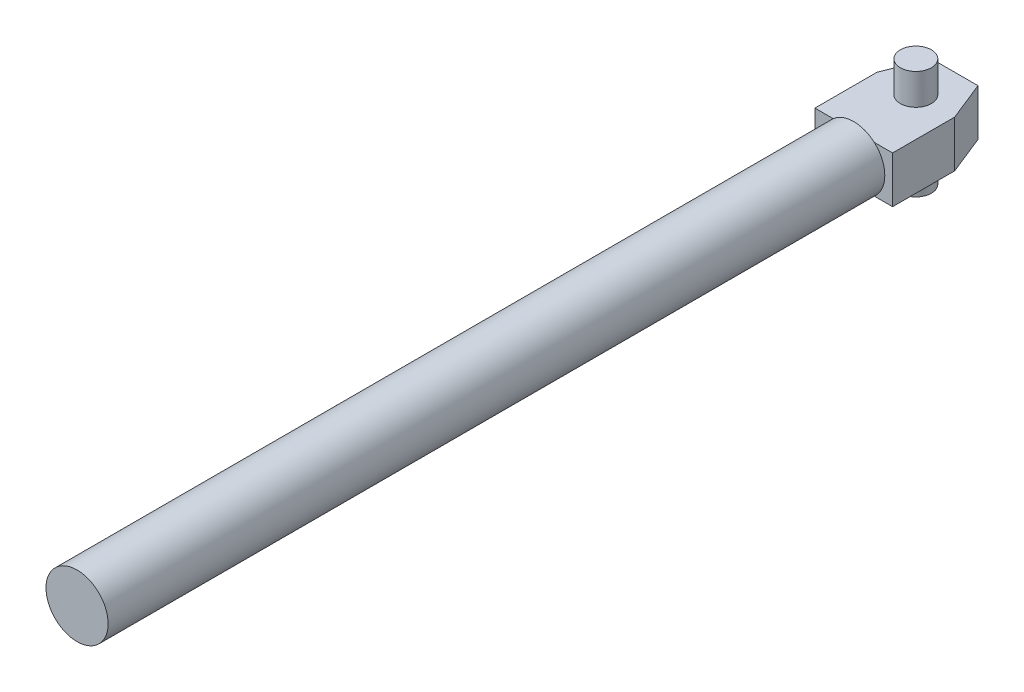
ISO-10303-21;
HEADER;
FILE_DESCRIPTION(('STEP AP214'),'2;1');
FILE_NAME('part.step','',(''),(''),'','','');
FILE_SCHEMA(('AUTOMOTIVE_DESIGN { 1 0 10303 214 1 1 1 1 }'));
ENDSEC;
DATA;
#1=APPLICATION_CONTEXT('core data for automotive mechanical design processes');
#2=APPLICATION_PROTOCOL_DEFINITION('international standard','automotive_design',2000,#1);
#3=PRODUCT_CONTEXT('',#1,'mechanical');
#4=PRODUCT('Part','Part','',(#3));
#5=PRODUCT_RELATED_PRODUCT_CATEGORY('part','',(#4));
#6=PRODUCT_DEFINITION_FORMATION('','',#4);
#7=PRODUCT_DEFINITION_CONTEXT('part definition',#1,'design');
#8=PRODUCT_DEFINITION('design','',#6,#7);
#9=PRODUCT_DEFINITION_SHAPE('','',#8);
#10=(LENGTH_UNIT() NAMED_UNIT(*) SI_UNIT(.MILLI.,.METRE.));
#11=(NAMED_UNIT(*) PLANE_ANGLE_UNIT() SI_UNIT($,.RADIAN.));
#12=(NAMED_UNIT(*) SI_UNIT($,.STERADIAN.) SOLID_ANGLE_UNIT());
#13=UNCERTAINTY_MEASURE_WITH_UNIT(LENGTH_MEASURE(1.E-05),#10,'distance_accuracy_value','');
#14=(GEOMETRIC_REPRESENTATION_CONTEXT(3) GLOBAL_UNCERTAINTY_ASSIGNED_CONTEXT((#13)) GLOBAL_UNIT_ASSIGNED_CONTEXT((#10,
#11,#12)) REPRESENTATION_CONTEXT('',''));
#15=CARTESIAN_POINT('',(0.,0.,0.));
#16=DIRECTION('',(0.,0.,1.));
#17=DIRECTION('',(1.,0.,0.));
#18=AXIS2_PLACEMENT_3D('',#15,#16,#17);
#19=CARTESIAN_POINT('',(0.,0.,0.));
#20=DIRECTION('',(0.,0.,1.));
#21=DIRECTION('',(1.,0.,0.));
#22=AXIS2_PLACEMENT_3D('',#19,#20,#21);
#23=PLANE('',#22);
#24=DIRECTION('',(1.,0.,0.));
#25=VECTOR('',#24,1.);
#26=CARTESIAN_POINT('',(-25.,15.,0.));
#27=LINE('',#26,#25);
#28=CARTESIAN_POINT('',(-13.2287565553229,15.,0.));
#29=VERTEX_POINT('',#28);
#30=CARTESIAN_POINT('',(13.2287565553229,15.,0.));
#31=VERTEX_POINT('',#30);
#32=EDGE_CURVE('E112',#29,#31,#27,.T.);
#33=ORIENTED_EDGE('',*,*,#32,.F.);
#34=CARTESIAN_POINT('',(0.,0.,0.));
#35=DIRECTION('',(0.,0.,1.));
#36=DIRECTION('',(1.,0.,0.));
#37=AXIS2_PLACEMENT_3D('',#34,#35,#36);
#38=CIRCLE('',#37,20.);
#39=EDGE_CURVE('E130',#31,#29,#38,.T.);
#40=ORIENTED_EDGE('',*,*,#39,.F.);
#41=EDGE_LOOP('',(#33,#40));
#42=FACE_BOUND('',#41,.T.);
#43=ADVANCED_FACE('F36',(#42),#23,.F.);
#44=CARTESIAN_POINT('',(0.,0.,500.));
#45=DIRECTION('',(0.,0.,-1.));
#46=DIRECTION('',(-1.,0.,0.));
#47=AXIS2_PLACEMENT_3D('',#44,#45,#46);
#48=CYLINDRICAL_SURFACE('',#47,20.);
#49=CARTESIAN_POINT('',(0.,0.,500.));
#50=DIRECTION('',(0.,0.,1.));
#51=DIRECTION('',(1.,0.,0.));
#52=AXIS2_PLACEMENT_3D('',#49,#50,#51);
#53=CIRCLE('',#52,20.);
#54=CARTESIAN_POINT('',(20.,0.,500.));
#55=VERTEX_POINT('',#54);
#56=EDGE_CURVE('E136',#55,#55,#53,.T.);
#57=ORIENTED_EDGE('',*,*,#56,.F.);
#58=EDGE_LOOP('',(#57));
#59=FACE_BOUND('',#58,.T.);
#60=ORIENTED_EDGE('',*,*,#39,.T.);
#61=CARTESIAN_POINT('',(-13.2287565553229,-15.,0.));
#62=VERTEX_POINT('',#61);
#63=EDGE_CURVE('E106',#29,#62,#38,.T.);
#64=ORIENTED_EDGE('',*,*,#63,.T.);
#65=CARTESIAN_POINT('',(13.2287565553229,-15.,0.));
#66=VERTEX_POINT('',#65);
#67=EDGE_CURVE('E52',#62,#66,#38,.T.);
#68=ORIENTED_EDGE('',*,*,#67,.T.);
#69=EDGE_CURVE('E126',#66,#31,#38,.T.);
#70=ORIENTED_EDGE('',*,*,#69,.T.);
#71=EDGE_LOOP('',(#60,#64,#68,#70));
#72=FACE_BOUND('',#71,.T.);
#73=ADVANCED_FACE('F38',(#59,#72),#48,.T.);
#74=CARTESIAN_POINT('',(0.,0.,500.));
#75=DIRECTION('',(0.,0.,1.));
#76=DIRECTION('',(1.,0.,0.));
#77=AXIS2_PLACEMENT_3D('',#74,#75,#76);
#78=PLANE('',#77);
#79=ORIENTED_EDGE('',*,*,#56,.T.);
#80=EDGE_LOOP('',(#79));
#81=FACE_BOUND('',#80,.T.);
#82=ADVANCED_FACE('F207',(#81),#78,.T.);
#83=ORIENTED_EDGE('',*,*,#67,.F.);
#84=DIRECTION('',(1.,0.,0.));
#85=VECTOR('',#84,1.);
#86=CARTESIAN_POINT('',(-25.,-15.,0.));
#87=LINE('',#86,#85);
#88=EDGE_CURVE('E44',#62,#66,#87,.T.);
#89=ORIENTED_EDGE('',*,*,#88,.T.);
#90=EDGE_LOOP('',(#83,#89));
#91=FACE_BOUND('',#90,.T.);
#92=ADVANCED_FACE('F203',(#91),#23,.F.);
#93=CARTESIAN_POINT('',(-25.,15.,0.));
#94=DIRECTION('',(0.,0.,-1.));
#95=DIRECTION('',(-1.,0.,0.));
#96=AXIS2_PLACEMENT_3D('',#93,#94,#95);
#97=PLANE('',#96);
#98=ORIENTED_EDGE('',*,*,#63,.F.);
#99=CARTESIAN_POINT('',(-25.,15.,0.));
#100=VERTEX_POINT('',#99);
#101=EDGE_CURVE('E99',#100,#29,#27,.T.);
#102=ORIENTED_EDGE('',*,*,#101,.F.);
#103=DIRECTION('',(0.,-1.,0.));
#104=VECTOR('',#103,1.);
#105=CARTESIAN_POINT('',(-25.,15.,0.));
#106=LINE('',#105,#104);
#107=CARTESIAN_POINT('',(-25.,-15.,0.));
#108=VERTEX_POINT('',#107);
#109=EDGE_CURVE('E104',#100,#108,#106,.T.);
#110=ORIENTED_EDGE('',*,*,#109,.T.);
#111=EDGE_CURVE('E152',#108,#62,#87,.T.);
#112=ORIENTED_EDGE('',*,*,#111,.T.);
#113=EDGE_LOOP('',(#98,#102,#110,#112));
#114=FACE_BOUND('',#113,.T.);
#115=ADVANCED_FACE('F101',(#114),#97,.F.);
#116=CARTESIAN_POINT('',(-25.,15.,0.));
#117=DIRECTION('',(1.,0.,0.));
#118=DIRECTION('',(0.,0.,-1.));
#119=AXIS2_PLACEMENT_3D('',#116,#117,#118);
#120=PLANE('',#119);
#121=DIRECTION('',(0.,0.,1.));
#122=VECTOR('',#121,1.);
#123=CARTESIAN_POINT('',(-25.,-15.,0.));
#124=LINE('',#123,#122);
#125=CARTESIAN_POINT('',(-25.,-15.,-40.));
#126=VERTEX_POINT('',#125);
#127=EDGE_CURVE('E125',#126,#108,#124,.T.);
#128=ORIENTED_EDGE('',*,*,#127,.T.);
#129=ORIENTED_EDGE('',*,*,#109,.F.);
#130=DIRECTION('',(0.,0.,1.));
#131=VECTOR('',#130,1.);
#132=CARTESIAN_POINT('',(-25.,15.,0.));
#133=LINE('',#132,#131);
#134=CARTESIAN_POINT('',(-25.,15.,-40.));
#135=VERTEX_POINT('',#134);
#136=EDGE_CURVE('E114',#135,#100,#133,.T.);
#137=ORIENTED_EDGE('',*,*,#136,.F.);
#138=DIRECTION('',(0.,-1.,0.));
#139=VECTOR('',#138,1.);
#140=CARTESIAN_POINT('',(-25.,15.,-40.));
#141=LINE('',#140,#139);
#142=EDGE_CURVE('E169',#135,#126,#141,.T.);
#143=ORIENTED_EDGE('',*,*,#142,.T.);
#144=EDGE_LOOP('',(#128,#129,#137,#143));
#145=FACE_BOUND('',#144,.T.);
#146=ADVANCED_FACE('F123',(#145),#120,.F.);
#147=ORIENTED_EDGE('',*,*,#69,.F.);
#148=CARTESIAN_POINT('',(25.,-15.,0.));
#149=VERTEX_POINT('',#148);
#150=EDGE_CURVE('E146',#66,#149,#87,.T.);
#151=ORIENTED_EDGE('',*,*,#150,.T.);
#152=DIRECTION('',(0.,-1.,0.));
#153=VECTOR('',#152,1.);
#154=CARTESIAN_POINT('',(25.,15.,0.));
#155=LINE('',#154,#153);
#156=CARTESIAN_POINT('',(25.,15.,0.));
#157=VERTEX_POINT('',#156);
#158=EDGE_CURVE('E127',#157,#149,#155,.T.);
#159=ORIENTED_EDGE('',*,*,#158,.F.);
#160=EDGE_CURVE('E110',#31,#157,#27,.T.);
#161=ORIENTED_EDGE('',*,*,#160,.F.);
#162=EDGE_LOOP('',(#147,#151,#159,#161));
#163=FACE_BOUND('',#162,.T.);
#164=ADVANCED_FACE('F144',(#163),#97,.F.);
#165=CARTESIAN_POINT('',(25.,15.,0.));
#166=DIRECTION('',(-1.,0.,0.));
#167=DIRECTION('',(0.,0.,1.));
#168=AXIS2_PLACEMENT_3D('',#165,#166,#167);
#169=PLANE('',#168);
#170=DIRECTION('',(0.,0.,-1.));
#171=VECTOR('',#170,1.);
#172=CARTESIAN_POINT('',(25.,-15.,0.));
#173=LINE('',#172,#171);
#174=CARTESIAN_POINT('',(25.,-15.,-40.));
#175=VERTEX_POINT('',#174);
#176=EDGE_CURVE('E151',#149,#175,#173,.T.);
#177=ORIENTED_EDGE('',*,*,#176,.T.);
#178=DIRECTION('',(0.,-1.,0.));
#179=VECTOR('',#178,1.);
#180=CARTESIAN_POINT('',(25.,15.,-40.));
#181=LINE('',#180,#179);
#182=CARTESIAN_POINT('',(25.,15.,-40.));
#183=VERTEX_POINT('',#182);
#184=EDGE_CURVE('E132',#183,#175,#181,.T.);
#185=ORIENTED_EDGE('',*,*,#184,.F.);
#186=DIRECTION('',(0.,0.,-1.));
#187=VECTOR('',#186,1.);
#188=CARTESIAN_POINT('',(25.,15.,0.));
#189=LINE('',#188,#187);
#190=EDGE_CURVE('E109',#157,#183,#189,.T.);
#191=ORIENTED_EDGE('',*,*,#190,.F.);
#192=ORIENTED_EDGE('',*,*,#158,.T.);
#193=EDGE_LOOP('',(#177,#185,#191,#192));
#194=FACE_BOUND('',#193,.T.);
#195=ADVANCED_FACE('F161',(#194),#169,.F.);
#196=CARTESIAN_POINT('',(15.,15.,-65.));
#197=DIRECTION('',(-0.928476690885259,0.,0.371390676354104));
#198=DIRECTION('',(0.371390676354104,0.,0.928476690885259));
#199=AXIS2_PLACEMENT_3D('',#196,#197,#198);
#200=PLANE('',#199);
#201=DIRECTION('',(-0.371390676354104,0.,-0.928476690885259));
#202=VECTOR('',#201,1.);
#203=CARTESIAN_POINT('',(15.,-15.,-65.));
#204=LINE('',#203,#202);
#205=CARTESIAN_POINT('',(15.,-15.,-65.));
#206=VERTEX_POINT('',#205);
#207=EDGE_CURVE('E182',#175,#206,#204,.T.);
#208=ORIENTED_EDGE('',*,*,#207,.T.);
#209=DIRECTION('',(0.,-1.,0.));
#210=VECTOR('',#209,1.);
#211=CARTESIAN_POINT('',(15.,15.,-65.));
#212=LINE('',#211,#210);
#213=CARTESIAN_POINT('',(15.,15.,-65.));
#214=VERTEX_POINT('',#213);
#215=EDGE_CURVE('E173',#214,#206,#212,.T.);
#216=ORIENTED_EDGE('',*,*,#215,.F.);
#217=DIRECTION('',(-0.371390676354104,0.,-0.928476690885259));
#218=VECTOR('',#217,1.);
#219=CARTESIAN_POINT('',(15.,15.,-65.));
#220=LINE('',#219,#218);
#221=EDGE_CURVE('E164',#183,#214,#220,.T.);
#222=ORIENTED_EDGE('',*,*,#221,.F.);
#223=ORIENTED_EDGE('',*,*,#184,.T.);
#224=EDGE_LOOP('',(#208,#216,#222,#223));
#225=FACE_BOUND('',#224,.T.);
#226=ADVANCED_FACE('F180',(#225),#200,.F.);
#227=CARTESIAN_POINT('',(-15.,15.,-65.));
#228=DIRECTION('',(0.,0.,1.));
#229=DIRECTION('',(1.,0.,0.));
#230=AXIS2_PLACEMENT_3D('',#227,#228,#229);
#231=PLANE('',#230);
#232=DIRECTION('',(-1.,0.,0.));
#233=VECTOR('',#232,1.);
#234=CARTESIAN_POINT('',(-15.,-15.,-65.));
#235=LINE('',#234,#233);
#236=CARTESIAN_POINT('',(-15.,-15.,-65.));
#237=VERTEX_POINT('',#236);
#238=EDGE_CURVE('E185',#206,#237,#235,.T.);
#239=ORIENTED_EDGE('',*,*,#238,.T.);
#240=DIRECTION('',(0.,-1.,0.));
#241=VECTOR('',#240,1.);
#242=CARTESIAN_POINT('',(-15.,15.,-65.));
#243=LINE('',#242,#241);
#244=CARTESIAN_POINT('',(-15.,15.,-65.));
#245=VERTEX_POINT('',#244);
#246=EDGE_CURVE('E170',#245,#237,#243,.T.);
#247=ORIENTED_EDGE('',*,*,#246,.F.);
#248=DIRECTION('',(-1.,0.,0.));
#249=VECTOR('',#248,1.);
#250=CARTESIAN_POINT('',(-15.,15.,-65.));
#251=LINE('',#250,#249);
#252=EDGE_CURVE('E165',#214,#245,#251,.T.);
#253=ORIENTED_EDGE('',*,*,#252,.F.);
#254=ORIENTED_EDGE('',*,*,#215,.T.);
#255=EDGE_LOOP('',(#239,#247,#253,#254));
#256=FACE_BOUND('',#255,.T.);
#257=ADVANCED_FACE('F192',(#256),#231,.F.);
#258=CARTESIAN_POINT('',(-25.,15.,-40.));
#259=DIRECTION('',(0.928476690885259,0.,0.371390676354103));
#260=DIRECTION('',(0.371390676354103,0.,-0.92847669088526));
#261=AXIS2_PLACEMENT_3D('',#258,#259,#260);
#262=PLANE('',#261);
#263=DIRECTION('',(-0.371390676354103,0.,0.928476690885259));
#264=VECTOR('',#263,1.);
#265=CARTESIAN_POINT('',(-25.,-15.,-40.));
#266=LINE('',#265,#264);
#267=EDGE_CURVE('E121',#237,#126,#266,.T.);
#268=ORIENTED_EDGE('',*,*,#267,.T.);
#269=ORIENTED_EDGE('',*,*,#142,.F.);
#270=DIRECTION('',(-0.371390676354103,0.,0.928476690885259));
#271=VECTOR('',#270,1.);
#272=CARTESIAN_POINT('',(-25.,15.,-40.));
#273=LINE('',#272,#271);
#274=EDGE_CURVE('E117',#245,#135,#273,.T.);
#275=ORIENTED_EDGE('',*,*,#274,.F.);
#276=ORIENTED_EDGE('',*,*,#246,.T.);
#277=EDGE_LOOP('',(#268,#269,#275,#276));
#278=FACE_BOUND('',#277,.T.);
#279=ADVANCED_FACE('F190',(#278),#262,.F.);
#280=CARTESIAN_POINT('',(0.,15.,0.));
#281=DIRECTION('',(0.,-1.,0.));
#282=DIRECTION('',(0.,0.,-1.));
#283=AXIS2_PLACEMENT_3D('',#280,#281,#282);
#284=PLANE('',#283);
#285=CARTESIAN_POINT('',(0.,15.,-40.));
#286=DIRECTION('',(0.,-1.,0.));
#287=DIRECTION('',(0.,0.,-1.));
#288=AXIS2_PLACEMENT_3D('',#285,#286,#287);
#289=CIRCLE('',#288,10.);
#290=CARTESIAN_POINT('',(0.,15.,-50.));
#291=VERTEX_POINT('',#290);
#292=EDGE_CURVE('E154',#291,#291,#289,.T.);
#293=ORIENTED_EDGE('',*,*,#292,.T.);
#294=EDGE_LOOP('',(#293));
#295=FACE_BOUND('',#294,.T.);
#296=ORIENTED_EDGE('',*,*,#136,.T.);
#297=ORIENTED_EDGE('',*,*,#101,.T.);
#298=ORIENTED_EDGE('',*,*,#32,.T.);
#299=ORIENTED_EDGE('',*,*,#160,.T.);
#300=ORIENTED_EDGE('',*,*,#190,.T.);
#301=ORIENTED_EDGE('',*,*,#221,.T.);
#302=ORIENTED_EDGE('',*,*,#252,.T.);
#303=ORIENTED_EDGE('',*,*,#274,.T.);
#304=EDGE_LOOP('',(#296,#297,#298,#299,#300,#301,#302,#303));
#305=FACE_BOUND('',#304,.T.);
#306=ADVANCED_FACE('F115',(#295,#305),#284,.F.);
#307=CARTESIAN_POINT('',(0.,-15.,0.));
#308=DIRECTION('',(0.,-1.,0.));
#309=DIRECTION('',(0.,0.,-1.));
#310=AXIS2_PLACEMENT_3D('',#307,#308,#309);
#311=PLANE('',#310);
#312=CARTESIAN_POINT('',(0.,-15.,-40.));
#313=DIRECTION('',(0.,-1.,0.));
#314=DIRECTION('',(0.,0.,-1.));
#315=AXIS2_PLACEMENT_3D('',#312,#313,#314);
#316=CIRCLE('',#315,10.);
#317=CARTESIAN_POINT('',(0.,-15.,-50.));
#318=VERTEX_POINT('',#317);
#319=EDGE_CURVE('E11',#318,#318,#316,.T.);
#320=ORIENTED_EDGE('',*,*,#319,.F.);
#321=EDGE_LOOP('',(#320));
#322=FACE_BOUND('',#321,.T.);
#323=ORIENTED_EDGE('',*,*,#127,.F.);
#324=ORIENTED_EDGE('',*,*,#267,.F.);
#325=ORIENTED_EDGE('',*,*,#238,.F.);
#326=ORIENTED_EDGE('',*,*,#207,.F.);
#327=ORIENTED_EDGE('',*,*,#176,.F.);
#328=ORIENTED_EDGE('',*,*,#150,.F.);
#329=ORIENTED_EDGE('',*,*,#88,.F.);
#330=ORIENTED_EDGE('',*,*,#111,.F.);
#331=EDGE_LOOP('',(#323,#324,#325,#326,#327,#328,#329,#330));
#332=FACE_BOUND('',#331,.T.);
#333=ADVANCED_FACE('F149',(#322,#332),#311,.T.);
#334=CARTESIAN_POINT('',(0.,-35.,-40.));
#335=DIRECTION('',(0.,1.,0.));
#336=DIRECTION('',(0.,0.,1.));
#337=AXIS2_PLACEMENT_3D('',#334,#335,#336);
#338=PLANE('',#337);
#339=CARTESIAN_POINT('',(0.,-35.,-40.));
#340=DIRECTION('',(0.,1.,0.));
#341=DIRECTION('',(0.,0.,1.));
#342=AXIS2_PLACEMENT_3D('',#339,#340,#341);
#343=CIRCLE('',#342,10.);
#344=CARTESIAN_POINT('',(0.,-35.,-30.));
#345=VERTEX_POINT('',#344);
#346=EDGE_CURVE('E306',#345,#345,#343,.T.);
#347=ORIENTED_EDGE('',*,*,#346,.F.);
#348=EDGE_LOOP('',(#347));
#349=FACE_BOUND('',#348,.T.);
#350=ADVANCED_FACE('F260',(#349),#338,.F.);
#351=CARTESIAN_POINT('',(0.,-35.,-40.));
#352=DIRECTION('',(0.,1.,0.));
#353=DIRECTION('',(0.,0.,1.));
#354=AXIS2_PLACEMENT_3D('',#351,#352,#353);
#355=CYLINDRICAL_SURFACE('',#354,10.);
#356=ORIENTED_EDGE('',*,*,#319,.T.);
#357=EDGE_LOOP('',(#356));
#358=FACE_BOUND('',#357,.T.);
#359=ORIENTED_EDGE('',*,*,#346,.T.);
#360=EDGE_LOOP('',(#359));
#361=FACE_BOUND('',#360,.T.);
#362=ADVANCED_FACE('F270',(#358,#361),#355,.T.);
#363=CARTESIAN_POINT('',(0.,35.,-40.));
#364=DIRECTION('',(0.,1.,0.));
#365=DIRECTION('',(0.,0.,1.));
#366=AXIS2_PLACEMENT_3D('',#363,#364,#365);
#367=CIRCLE('',#366,10.);
#368=CARTESIAN_POINT('',(0.,35.,-30.));
#369=VERTEX_POINT('',#368);
#370=EDGE_CURVE('E305',#369,#369,#367,.T.);
#371=ORIENTED_EDGE('',*,*,#370,.F.);
#372=EDGE_LOOP('',(#371));
#373=FACE_BOUND('',#372,.T.);
#374=ORIENTED_EDGE('',*,*,#292,.F.);
#375=EDGE_LOOP('',(#374));
#376=FACE_BOUND('',#375,.T.);
#377=ADVANCED_FACE('F280',(#373,#376),#355,.T.);
#378=CARTESIAN_POINT('',(0.,35.,-40.));
#379=DIRECTION('',(0.,1.,0.));
#380=DIRECTION('',(0.,0.,1.));
#381=AXIS2_PLACEMENT_3D('',#378,#379,#380);
#382=PLANE('',#381);
#383=ORIENTED_EDGE('',*,*,#370,.T.);
#384=EDGE_LOOP('',(#383));
#385=FACE_BOUND('',#384,.T.);
#386=ADVANCED_FACE('F290',(#385),#382,.T.);
#387=CLOSED_SHELL('',(#43,#73,#82,#92,#115,#146,#164,#195,#226,#257,#279,#306,#333,#350,#362,
#377,#386));
#388=MANIFOLD_SOLID_BREP('B2',#387);
#389=ADVANCED_BREP_SHAPE_REPRESENTATION('',(#18,#388),#14);
#390=SHAPE_DEFINITION_REPRESENTATION(#9,#389);
ENDSEC;
END-ISO-10303-21;
